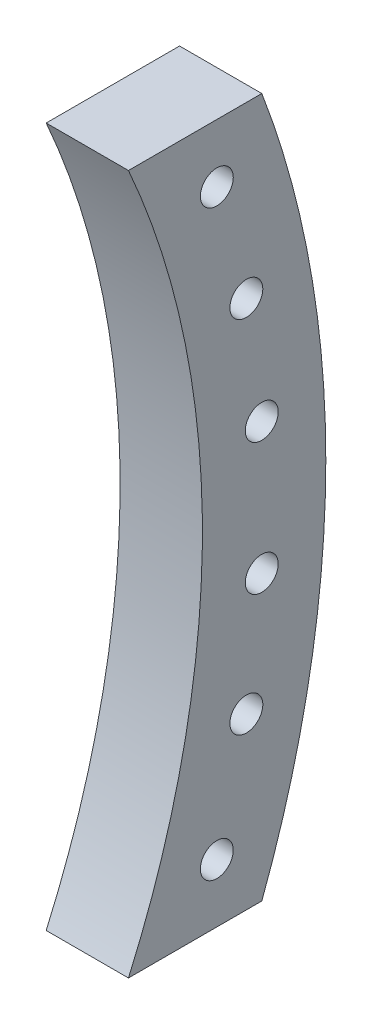
ISO-10303-21;
HEADER;
FILE_DESCRIPTION(('STEP AP214'),'2;1');
FILE_NAME('part.step','',(''),(''),'','','');
FILE_SCHEMA(('AUTOMOTIVE_DESIGN { 1 0 10303 214 1 1 1 1 }'));
ENDSEC;
DATA;
#1=APPLICATION_CONTEXT('core data for automotive mechanical design processes');
#2=APPLICATION_PROTOCOL_DEFINITION('international standard','automotive_design',2000,#1);
#3=PRODUCT_CONTEXT('',#1,'mechanical');
#4=PRODUCT('Part','Part','',(#3));
#5=PRODUCT_RELATED_PRODUCT_CATEGORY('part','',(#4));
#6=PRODUCT_DEFINITION_FORMATION('','',#4);
#7=PRODUCT_DEFINITION_CONTEXT('part definition',#1,'design');
#8=PRODUCT_DEFINITION('design','',#6,#7);
#9=PRODUCT_DEFINITION_SHAPE('','',#8);
#10=(LENGTH_UNIT() NAMED_UNIT(*) SI_UNIT(.MILLI.,.METRE.));
#11=(NAMED_UNIT(*) PLANE_ANGLE_UNIT() SI_UNIT($,.RADIAN.));
#12=(NAMED_UNIT(*) SI_UNIT($,.STERADIAN.) SOLID_ANGLE_UNIT());
#13=UNCERTAINTY_MEASURE_WITH_UNIT(LENGTH_MEASURE(1.E-05),#10,'distance_accuracy_value','');
#14=(GEOMETRIC_REPRESENTATION_CONTEXT(3) GLOBAL_UNCERTAINTY_ASSIGNED_CONTEXT((#13)) GLOBAL_UNIT_ASSIGNED_CONTEXT((#10,
#11,#12)) REPRESENTATION_CONTEXT('',''));
#15=CARTESIAN_POINT('',(0.,0.,0.));
#16=DIRECTION('',(0.,0.,1.));
#17=DIRECTION('',(1.,0.,0.));
#18=AXIS2_PLACEMENT_3D('',#15,#16,#17);
#19=CARTESIAN_POINT('',(-20.,9.05000000000002,-14.));
#20=DIRECTION('',(1.,0.,0.));
#21=DIRECTION('',(0.,0.,1.));
#22=AXIS2_PLACEMENT_3D('',#19,#20,#21);
#23=PLANE('',#22);
#24=CARTESIAN_POINT('',(-20.,9.05000000000002,-14.));
#25=DIRECTION('',(-1.,0.,0.));
#26=DIRECTION('',(0.,0.,1.));
#27=AXIS2_PLACEMENT_3D('',#24,#25,#26);
#28=CIRCLE('',#27,105.);
#29=CARTESIAN_POINT('',(-20.,51.55,-110.014321848358));
#30=VERTEX_POINT('',#29);
#31=CARTESIAN_POINT('',(-20.,-33.45,-110.014321848358));
#32=VERTEX_POINT('',#31);
#33=EDGE_CURVE('E92',#30,#32,#28,.T.);
#34=ORIENTED_EDGE('',*,*,#33,.F.);
#35=DIRECTION('',(0.,0.,1.));
#36=VECTOR('',#35,1.);
#37=CARTESIAN_POINT('',(-20.,51.55,-110.014321848358));
#38=LINE('',#37,#36);
#39=CARTESIAN_POINT('',(-20.,51.55,-126.221878437317));
#40=VERTEX_POINT('',#39);
#41=EDGE_CURVE('E95',#40,#30,#38,.T.);
#42=ORIENTED_EDGE('',*,*,#41,.F.);
#43=CARTESIAN_POINT('',(-20.,9.05000000000002,-14.));
#44=DIRECTION('',(1.,0.,0.));
#45=DIRECTION('',(0.,0.,1.));
#46=AXIS2_PLACEMENT_3D('',#43,#44,#45);
#47=CIRCLE('',#46,120.);
#48=CARTESIAN_POINT('',(-20.,-33.45,-126.221878437317));
#49=VERTEX_POINT('',#48);
#50=EDGE_CURVE('E83',#49,#40,#47,.T.);
#51=ORIENTED_EDGE('',*,*,#50,.F.);
#52=DIRECTION('',(0.,0.,-1.));
#53=VECTOR('',#52,1.);
#54=CARTESIAN_POINT('',(-20.,-33.45,-110.014321848358));
#55=LINE('',#54,#53);
#56=EDGE_CURVE('E88',#32,#49,#55,.T.);
#57=ORIENTED_EDGE('',*,*,#56,.F.);
#58=EDGE_LOOP('',(#34,#42,#51,#57));
#59=FACE_BOUND('',#58,.T.);
#60=CARTESIAN_POINT('',(-20.,17.05,-126.213761495822));
#61=DIRECTION('',(1.,0.,0.));
#62=DIRECTION('',(0.,0.,-1.));
#63=AXIS2_PLACEMENT_3D('',#60,#61,#62);
#64=CIRCLE('',#63,2.);
#65=CARTESIAN_POINT('',(-20.,17.05,-128.213761495822));
#66=VERTEX_POINT('',#65);
#67=EDGE_CURVE('E104',#66,#66,#64,.T.);
#68=ORIENTED_EDGE('',*,*,#67,.T.);
#69=EDGE_LOOP('',(#68));
#70=FACE_BOUND('',#69,.T.);
#71=CARTESIAN_POINT('',(-20.,30.9243003232221,-124.341920011871));
#72=DIRECTION('',(1.,0.,0.));
#73=DIRECTION('',(0.,0.,-1.));
#74=AXIS2_PLACEMENT_3D('',#71,#72,#73);
#75=CIRCLE('',#74,1.99999999999997);
#76=CARTESIAN_POINT('',(-20.,30.9243003232221,-126.341920011871));
#77=VERTEX_POINT('',#76);
#78=EDGE_CURVE('E115',#77,#77,#75,.T.);
#79=ORIENTED_EDGE('',*,*,#78,.T.);
#80=EDGE_LOOP('',(#79));
#81=FACE_BOUND('',#80,.T.);
#82=CARTESIAN_POINT('',(-20.,44.4564359955439,-120.752866634464));
#83=DIRECTION('',(1.,0.,0.));
#84=DIRECTION('',(0.,0.,-1.));
#85=AXIS2_PLACEMENT_3D('',#82,#83,#84);
#86=CIRCLE('',#85,2.);
#87=CARTESIAN_POINT('',(-20.,44.4564359955439,-122.752866634464));
#88=VERTEX_POINT('',#87);
#89=EDGE_CURVE('E121',#88,#88,#86,.T.);
#90=ORIENTED_EDGE('',*,*,#89,.T.);
#91=EDGE_LOOP('',(#90));
#92=FACE_BOUND('',#91,.T.);
#93=CARTESIAN_POINT('',(-20.,1.05000000000006,-126.213761495822));
#94=DIRECTION('',(1.,0.,0.));
#95=DIRECTION('',(0.,0.,1.));
#96=AXIS2_PLACEMENT_3D('',#93,#94,#95);
#97=CIRCLE('',#96,2.);
#98=CARTESIAN_POINT('',(-20.,1.05000000000006,-124.213761495822));
#99=VERTEX_POINT('',#98);
#100=EDGE_CURVE('E127',#99,#99,#97,.T.);
#101=ORIENTED_EDGE('',*,*,#100,.T.);
#102=EDGE_LOOP('',(#101));
#103=FACE_BOUND('',#102,.T.);
#104=CARTESIAN_POINT('',(-20.,-12.824300323222,-124.341920011871));
#105=DIRECTION('',(1.,0.,0.));
#106=DIRECTION('',(0.,0.,1.));
#107=AXIS2_PLACEMENT_3D('',#104,#105,#106);
#108=CIRCLE('',#107,1.99999999999997);
#109=CARTESIAN_POINT('',(-20.,-12.824300323222,-122.341920011871));
#110=VERTEX_POINT('',#109);
#111=EDGE_CURVE('E133',#110,#110,#108,.T.);
#112=ORIENTED_EDGE('',*,*,#111,.T.);
#113=EDGE_LOOP('',(#112));
#114=FACE_BOUND('',#113,.T.);
#115=CARTESIAN_POINT('',(-20.,-26.3564359955439,-120.752866634464));
#116=DIRECTION('',(1.,0.,0.));
#117=DIRECTION('',(0.,0.,1.));
#118=AXIS2_PLACEMENT_3D('',#115,#116,#117);
#119=CIRCLE('',#118,2.);
#120=CARTESIAN_POINT('',(-20.,-26.3564359955439,-118.752866634464));
#121=VERTEX_POINT('',#120);
#122=EDGE_CURVE('E139',#121,#121,#119,.T.);
#123=ORIENTED_EDGE('',*,*,#122,.T.);
#124=EDGE_LOOP('',(#123));
#125=FACE_BOUND('',#124,.T.);
#126=ADVANCED_FACE('F36',(#59,#70,#81,#92,#103,#114,#125),#23,.F.);
#127=CARTESIAN_POINT('',(-10.,9.05000000000002,-14.));
#128=DIRECTION('',(1.,0.,0.));
#129=DIRECTION('',(0.,0.,1.));
#130=AXIS2_PLACEMENT_3D('',#127,#128,#129);
#131=PLANE('',#130);
#132=CARTESIAN_POINT('',(-10.,-12.824300323222,-124.341920011871));
#133=DIRECTION('',(1.,0.,0.));
#134=DIRECTION('',(0.,0.,1.));
#135=AXIS2_PLACEMENT_3D('',#132,#133,#134);
#136=CIRCLE('',#135,1.99999999999997);
#137=CARTESIAN_POINT('',(-10.,-12.824300323222,-122.341920011871));
#138=VERTEX_POINT('',#137);
#139=EDGE_CURVE('E136',#138,#138,#136,.T.);
#140=ORIENTED_EDGE('',*,*,#139,.F.);
#141=EDGE_LOOP('',(#140));
#142=FACE_BOUND('',#141,.T.);
#143=CARTESIAN_POINT('',(-10.,44.4564359955439,-120.752866634464));
#144=DIRECTION('',(1.,0.,0.));
#145=DIRECTION('',(0.,0.,-1.));
#146=AXIS2_PLACEMENT_3D('',#143,#144,#145);
#147=CIRCLE('',#146,2.);
#148=CARTESIAN_POINT('',(-10.,44.4564359955439,-122.752866634464));
#149=VERTEX_POINT('',#148);
#150=EDGE_CURVE('E124',#149,#149,#147,.T.);
#151=ORIENTED_EDGE('',*,*,#150,.F.);
#152=EDGE_LOOP('',(#151));
#153=FACE_BOUND('',#152,.T.);
#154=CARTESIAN_POINT('',(-10.,17.05,-126.213761495822));
#155=DIRECTION('',(1.,0.,0.));
#156=DIRECTION('',(0.,0.,-1.));
#157=AXIS2_PLACEMENT_3D('',#154,#155,#156);
#158=CIRCLE('',#157,2.);
#159=CARTESIAN_POINT('',(-10.,17.05,-128.213761495822));
#160=VERTEX_POINT('',#159);
#161=EDGE_CURVE('E112',#160,#160,#158,.T.);
#162=ORIENTED_EDGE('',*,*,#161,.F.);
#163=EDGE_LOOP('',(#162));
#164=FACE_BOUND('',#163,.T.);
#165=CARTESIAN_POINT('',(-10.,9.05000000000002,-14.));
#166=DIRECTION('',(-1.,0.,0.));
#167=DIRECTION('',(0.,0.,1.));
#168=AXIS2_PLACEMENT_3D('',#165,#166,#167);
#169=CIRCLE('',#168,105.);
#170=CARTESIAN_POINT('',(-10.,51.55,-110.014321848358));
#171=VERTEX_POINT('',#170);
#172=CARTESIAN_POINT('',(-10.,-33.45,-110.014321848358));
#173=VERTEX_POINT('',#172);
#174=EDGE_CURVE('E100',#171,#173,#169,.T.);
#175=ORIENTED_EDGE('',*,*,#174,.T.);
#176=DIRECTION('',(0.,0.,-1.));
#177=VECTOR('',#176,1.);
#178=CARTESIAN_POINT('',(-10.,-33.45,-110.014321848358));
#179=LINE('',#178,#177);
#180=CARTESIAN_POINT('',(-10.,-33.45,-126.221878437317));
#181=VERTEX_POINT('',#180);
#182=EDGE_CURVE('E103',#173,#181,#179,.T.);
#183=ORIENTED_EDGE('',*,*,#182,.T.);
#184=CARTESIAN_POINT('',(-10.,9.05000000000002,-14.));
#185=DIRECTION('',(1.,0.,0.));
#186=DIRECTION('',(0.,0.,1.));
#187=AXIS2_PLACEMENT_3D('',#184,#185,#186);
#188=CIRCLE('',#187,120.);
#189=CARTESIAN_POINT('',(-10.,51.55,-126.221878437317));
#190=VERTEX_POINT('',#189);
#191=EDGE_CURVE('E86',#181,#190,#188,.T.);
#192=ORIENTED_EDGE('',*,*,#191,.T.);
#193=DIRECTION('',(0.,0.,1.));
#194=VECTOR('',#193,1.);
#195=CARTESIAN_POINT('',(-10.,51.55,-110.014321848358));
#196=LINE('',#195,#194);
#197=EDGE_CURVE('E107',#190,#171,#196,.T.);
#198=ORIENTED_EDGE('',*,*,#197,.T.);
#199=EDGE_LOOP('',(#175,#183,#192,#198));
#200=FACE_BOUND('',#199,.T.);
#201=CARTESIAN_POINT('',(-10.,30.9243003232221,-124.341920011871));
#202=DIRECTION('',(1.,0.,0.));
#203=DIRECTION('',(0.,0.,-1.));
#204=AXIS2_PLACEMENT_3D('',#201,#202,#203);
#205=CIRCLE('',#204,1.99999999999997);
#206=CARTESIAN_POINT('',(-10.,30.9243003232221,-126.341920011871));
#207=VERTEX_POINT('',#206);
#208=EDGE_CURVE('E118',#207,#207,#205,.T.);
#209=ORIENTED_EDGE('',*,*,#208,.F.);
#210=EDGE_LOOP('',(#209));
#211=FACE_BOUND('',#210,.T.);
#212=CARTESIAN_POINT('',(-10.,1.05000000000006,-126.213761495822));
#213=DIRECTION('',(1.,0.,0.));
#214=DIRECTION('',(0.,0.,1.));
#215=AXIS2_PLACEMENT_3D('',#212,#213,#214);
#216=CIRCLE('',#215,2.);
#217=CARTESIAN_POINT('',(-10.,1.05000000000006,-124.213761495822));
#218=VERTEX_POINT('',#217);
#219=EDGE_CURVE('E130',#218,#218,#216,.T.);
#220=ORIENTED_EDGE('',*,*,#219,.F.);
#221=EDGE_LOOP('',(#220));
#222=FACE_BOUND('',#221,.T.);
#223=CARTESIAN_POINT('',(-10.,-26.3564359955439,-120.752866634464));
#224=DIRECTION('',(1.,0.,0.));
#225=DIRECTION('',(0.,0.,1.));
#226=AXIS2_PLACEMENT_3D('',#223,#224,#225);
#227=CIRCLE('',#226,2.);
#228=CARTESIAN_POINT('',(-10.,-26.3564359955439,-118.752866634464));
#229=VERTEX_POINT('',#228);
#230=EDGE_CURVE('E142',#229,#229,#227,.T.);
#231=ORIENTED_EDGE('',*,*,#230,.F.);
#232=EDGE_LOOP('',(#231));
#233=FACE_BOUND('',#232,.T.);
#234=ADVANCED_FACE('F156',(#142,#153,#164,#200,#211,#222,#233),#131,.T.);
#235=CARTESIAN_POINT('',(-20.,9.05000000000002,-14.));
#236=DIRECTION('',(1.,0.,0.));
#237=DIRECTION('',(0.,0.,1.));
#238=AXIS2_PLACEMENT_3D('',#235,#236,#237);
#239=CYLINDRICAL_SURFACE('',#238,105.);
#240=ORIENTED_EDGE('',*,*,#174,.F.);
#241=DIRECTION('',(1.,0.,0.));
#242=VECTOR('',#241,1.);
#243=CARTESIAN_POINT('',(-20.,51.55,-110.014321848358));
#244=LINE('',#243,#242);
#245=EDGE_CURVE('E53',#30,#171,#244,.T.);
#246=ORIENTED_EDGE('',*,*,#245,.F.);
#247=ORIENTED_EDGE('',*,*,#33,.T.);
#248=DIRECTION('',(1.,0.,0.));
#249=VECTOR('',#248,1.);
#250=CARTESIAN_POINT('',(-20.,-33.45,-110.014321848358));
#251=LINE('',#250,#249);
#252=EDGE_CURVE('E11',#32,#173,#251,.T.);
#253=ORIENTED_EDGE('',*,*,#252,.T.);
#254=EDGE_LOOP('',(#240,#246,#247,#253));
#255=FACE_BOUND('',#254,.T.);
#256=ADVANCED_FACE('F38',(#255),#239,.F.);
#257=CARTESIAN_POINT('',(-20.,-33.45,-110.014321848358));
#258=DIRECTION('',(0.,1.,0.));
#259=DIRECTION('',(0.,0.,1.));
#260=AXIS2_PLACEMENT_3D('',#257,#258,#259);
#261=PLANE('',#260);
#262=ORIENTED_EDGE('',*,*,#182,.F.);
#263=ORIENTED_EDGE('',*,*,#252,.F.);
#264=ORIENTED_EDGE('',*,*,#56,.T.);
#265=DIRECTION('',(1.,0.,0.));
#266=VECTOR('',#265,1.);
#267=CARTESIAN_POINT('',(-20.,-33.45,-126.221878437317));
#268=LINE('',#267,#266);
#269=EDGE_CURVE('E45',#49,#181,#268,.T.);
#270=ORIENTED_EDGE('',*,*,#269,.T.);
#271=EDGE_LOOP('',(#262,#263,#264,#270));
#272=FACE_BOUND('',#271,.T.);
#273=ADVANCED_FACE('F89',(#272),#261,.F.);
#274=CARTESIAN_POINT('',(-20.,9.05000000000002,-14.));
#275=DIRECTION('',(1.,0.,0.));
#276=DIRECTION('',(0.,0.,1.));
#277=AXIS2_PLACEMENT_3D('',#274,#275,#276);
#278=CYLINDRICAL_SURFACE('',#277,120.);
#279=ORIENTED_EDGE('',*,*,#191,.F.);
#280=ORIENTED_EDGE('',*,*,#269,.F.);
#281=ORIENTED_EDGE('',*,*,#50,.T.);
#282=DIRECTION('',(1.,0.,0.));
#283=VECTOR('',#282,1.);
#284=CARTESIAN_POINT('',(-20.,51.55,-126.221878437317));
#285=LINE('',#284,#283);
#286=EDGE_CURVE('E69',#40,#190,#285,.T.);
#287=ORIENTED_EDGE('',*,*,#286,.T.);
#288=EDGE_LOOP('',(#279,#280,#281,#287));
#289=FACE_BOUND('',#288,.T.);
#290=ADVANCED_FACE('F81',(#289),#278,.T.);
#291=CARTESIAN_POINT('',(-20.,51.55,-110.014321848358));
#292=DIRECTION('',(0.,-1.,0.));
#293=DIRECTION('',(0.,0.,-1.));
#294=AXIS2_PLACEMENT_3D('',#291,#292,#293);
#295=PLANE('',#294);
#296=ORIENTED_EDGE('',*,*,#197,.F.);
#297=ORIENTED_EDGE('',*,*,#286,.F.);
#298=ORIENTED_EDGE('',*,*,#41,.T.);
#299=ORIENTED_EDGE('',*,*,#245,.T.);
#300=EDGE_LOOP('',(#296,#297,#298,#299));
#301=FACE_BOUND('',#300,.T.);
#302=ADVANCED_FACE('F169',(#301),#295,.F.);
#303=CARTESIAN_POINT('',(-20.,17.05,-126.213761495822));
#304=DIRECTION('',(1.,0.,0.));
#305=DIRECTION('',(0.,0.,1.));
#306=AXIS2_PLACEMENT_3D('',#303,#304,#305);
#307=CYLINDRICAL_SURFACE('',#306,2.);
#308=ORIENTED_EDGE('',*,*,#67,.F.);
#309=EDGE_LOOP('',(#308));
#310=FACE_BOUND('',#309,.T.);
#311=ORIENTED_EDGE('',*,*,#161,.T.);
#312=EDGE_LOOP('',(#311));
#313=FACE_BOUND('',#312,.T.);
#314=ADVANCED_FACE('F172',(#310,#313),#307,.F.);
#315=CARTESIAN_POINT('',(-20.,30.9243003232221,-124.341920011871));
#316=DIRECTION('',(1.,0.,0.));
#317=DIRECTION('',(0.,0.,1.));
#318=AXIS2_PLACEMENT_3D('',#315,#316,#317);
#319=CYLINDRICAL_SURFACE('',#318,1.99999999999997);
#320=ORIENTED_EDGE('',*,*,#78,.F.);
#321=EDGE_LOOP('',(#320));
#322=FACE_BOUND('',#321,.T.);
#323=ORIENTED_EDGE('',*,*,#208,.T.);
#324=EDGE_LOOP('',(#323));
#325=FACE_BOUND('',#324,.T.);
#326=ADVANCED_FACE('F196',(#322,#325),#319,.F.);
#327=CARTESIAN_POINT('',(-20.,44.4564359955439,-120.752866634464));
#328=DIRECTION('',(1.,0.,0.));
#329=DIRECTION('',(0.,0.,1.));
#330=AXIS2_PLACEMENT_3D('',#327,#328,#329);
#331=CYLINDRICAL_SURFACE('',#330,2.);
#332=ORIENTED_EDGE('',*,*,#89,.F.);
#333=EDGE_LOOP('',(#332));
#334=FACE_BOUND('',#333,.T.);
#335=ORIENTED_EDGE('',*,*,#150,.T.);
#336=EDGE_LOOP('',(#335));
#337=FACE_BOUND('',#336,.T.);
#338=ADVANCED_FACE('F204',(#334,#337),#331,.F.);
#339=CARTESIAN_POINT('',(-20.,1.05000000000006,-126.213761495822));
#340=DIRECTION('',(1.,0.,0.));
#341=DIRECTION('',(0.,0.,1.));
#342=AXIS2_PLACEMENT_3D('',#339,#340,#341);
#343=CYLINDRICAL_SURFACE('',#342,2.);
#344=ORIENTED_EDGE('',*,*,#100,.F.);
#345=EDGE_LOOP('',(#344));
#346=FACE_BOUND('',#345,.T.);
#347=ORIENTED_EDGE('',*,*,#219,.T.);
#348=EDGE_LOOP('',(#347));
#349=FACE_BOUND('',#348,.T.);
#350=ADVANCED_FACE('F213',(#346,#349),#343,.F.);
#351=CARTESIAN_POINT('',(-20.,-12.824300323222,-124.341920011871));
#352=DIRECTION('',(1.,0.,0.));
#353=DIRECTION('',(0.,0.,1.));
#354=AXIS2_PLACEMENT_3D('',#351,#352,#353);
#355=CYLINDRICAL_SURFACE('',#354,1.99999999999997);
#356=ORIENTED_EDGE('',*,*,#111,.F.);
#357=EDGE_LOOP('',(#356));
#358=FACE_BOUND('',#357,.T.);
#359=ORIENTED_EDGE('',*,*,#139,.T.);
#360=EDGE_LOOP('',(#359));
#361=FACE_BOUND('',#360,.T.);
#362=ADVANCED_FACE('F152',(#358,#361),#355,.F.);
#363=CARTESIAN_POINT('',(-20.,-26.3564359955439,-120.752866634464));
#364=DIRECTION('',(1.,0.,0.));
#365=DIRECTION('',(0.,0.,1.));
#366=AXIS2_PLACEMENT_3D('',#363,#364,#365);
#367=CYLINDRICAL_SURFACE('',#366,2.);
#368=ORIENTED_EDGE('',*,*,#122,.F.);
#369=EDGE_LOOP('',(#368));
#370=FACE_BOUND('',#369,.T.);
#371=ORIENTED_EDGE('',*,*,#230,.T.);
#372=EDGE_LOOP('',(#371));
#373=FACE_BOUND('',#372,.T.);
#374=ADVANCED_FACE('F149',(#370,#373),#367,.F.);
#375=CLOSED_SHELL('',(#126,#234,#256,#273,#290,#302,#314,#326,#338,#350,#362,#374));
#376=MANIFOLD_SOLID_BREP('B2',#375);
#377=ADVANCED_BREP_SHAPE_REPRESENTATION('',(#18,#376),#14);
#378=SHAPE_DEFINITION_REPRESENTATION(#9,#377);
ENDSEC;
END-ISO-10303-21;
